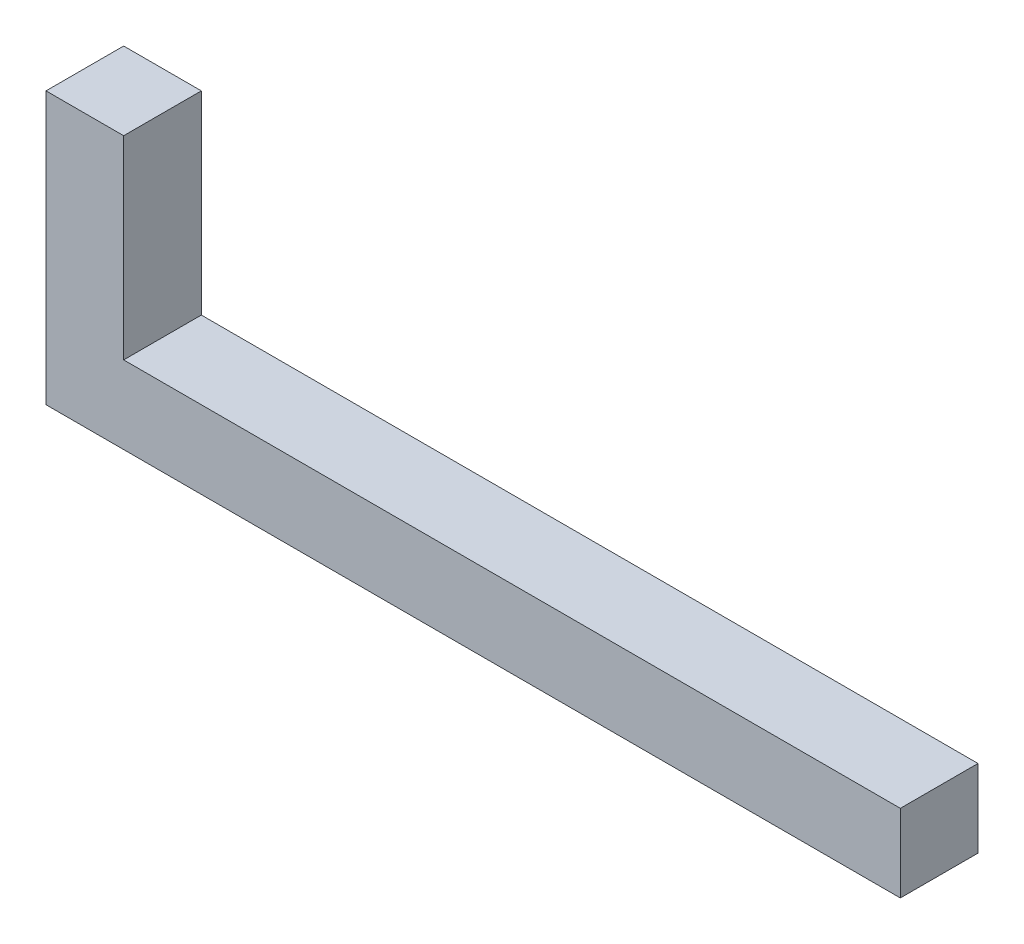
ISO-10303-21;
HEADER;
FILE_DESCRIPTION(('STEP AP214'),'2;1');
FILE_NAME('part.step','',(''),(''),'','','');
FILE_SCHEMA(('AUTOMOTIVE_DESIGN { 1 0 10303 214 1 1 1 1 }'));
ENDSEC;
DATA;
#1=APPLICATION_CONTEXT('core data for automotive mechanical design processes');
#2=APPLICATION_PROTOCOL_DEFINITION('international standard','automotive_design',2000,#1);
#3=PRODUCT_CONTEXT('',#1,'mechanical');
#4=PRODUCT('Part','Part','',(#3));
#5=PRODUCT_RELATED_PRODUCT_CATEGORY('part','',(#4));
#6=PRODUCT_DEFINITION_FORMATION('','',#4);
#7=PRODUCT_DEFINITION_CONTEXT('part definition',#1,'design');
#8=PRODUCT_DEFINITION('design','',#6,#7);
#9=PRODUCT_DEFINITION_SHAPE('','',#8);
#10=(LENGTH_UNIT() NAMED_UNIT(*) SI_UNIT(.MILLI.,.METRE.));
#11=(NAMED_UNIT(*) PLANE_ANGLE_UNIT() SI_UNIT($,.RADIAN.));
#12=(NAMED_UNIT(*) SI_UNIT($,.STERADIAN.) SOLID_ANGLE_UNIT());
#13=UNCERTAINTY_MEASURE_WITH_UNIT(LENGTH_MEASURE(1.E-05),#10,'distance_accuracy_value','');
#14=(GEOMETRIC_REPRESENTATION_CONTEXT(3) GLOBAL_UNCERTAINTY_ASSIGNED_CONTEXT((#13)) GLOBAL_UNIT_ASSIGNED_CONTEXT((#10,
#11,#12)) REPRESENTATION_CONTEXT('',''));
#15=CARTESIAN_POINT('',(0.,0.,0.));
#16=DIRECTION('',(0.,0.,1.));
#17=DIRECTION('',(1.,0.,0.));
#18=AXIS2_PLACEMENT_3D('',#15,#16,#17);
#19=CARTESIAN_POINT('',(0.,0.,10.));
#20=DIRECTION('',(-1.,0.,0.));
#21=DIRECTION('',(0.,-1.,0.));
#22=AXIS2_PLACEMENT_3D('',#19,#20,#21);
#23=PLANE('',#22);
#24=DIRECTION('',(0.,1.,0.));
#25=VECTOR('',#24,1.);
#26=CARTESIAN_POINT('',(0.,0.,0.));
#27=LINE('',#26,#25);
#28=CARTESIAN_POINT('',(0.,-10.,0.));
#29=VERTEX_POINT('',#28);
#30=CARTESIAN_POINT('',(0.,0.,0.));
#31=VERTEX_POINT('',#30);
#32=EDGE_CURVE('E128',#29,#31,#27,.T.);
#33=ORIENTED_EDGE('',*,*,#32,.T.);
#34=DIRECTION('',(0.,0.,-1.));
#35=VECTOR('',#34,1.);
#36=CARTESIAN_POINT('',(0.,0.,10.));
#37=LINE('',#36,#35);
#38=CARTESIAN_POINT('',(0.,0.,10.));
#39=VERTEX_POINT('',#38);
#40=EDGE_CURVE('E11',#39,#31,#37,.T.);
#41=ORIENTED_EDGE('',*,*,#40,.F.);
#42=DIRECTION('',(0.,1.,0.));
#43=VECTOR('',#42,1.);
#44=CARTESIAN_POINT('',(0.,0.,10.));
#45=LINE('',#44,#43);
#46=CARTESIAN_POINT('',(0.,-10.,10.));
#47=VERTEX_POINT('',#46);
#48=EDGE_CURVE('E144',#47,#39,#45,.T.);
#49=ORIENTED_EDGE('',*,*,#48,.F.);
#50=DIRECTION('',(0.,0.,-1.));
#51=VECTOR('',#50,1.);
#52=CARTESIAN_POINT('',(0.,-10.,10.));
#53=LINE('',#52,#51);
#54=EDGE_CURVE('E124',#47,#29,#53,.T.);
#55=ORIENTED_EDGE('',*,*,#54,.T.);
#56=EDGE_LOOP('',(#33,#41,#49,#55));
#57=FACE_BOUND('',#56,.T.);
#58=ADVANCED_FACE('F39',(#57),#23,.F.);
#59=CARTESIAN_POINT('',(0.,0.,10.));
#60=DIRECTION('',(0.,-1.,0.));
#61=DIRECTION('',(1.,0.,0.));
#62=AXIS2_PLACEMENT_3D('',#59,#60,#61);
#63=PLANE('',#62);
#64=DIRECTION('',(-1.,0.,0.));
#65=VECTOR('',#64,1.);
#66=CARTESIAN_POINT('',(0.,0.,0.));
#67=LINE('',#66,#65);
#68=CARTESIAN_POINT('',(-100.,0.,0.));
#69=VERTEX_POINT('',#68);
#70=EDGE_CURVE('E132',#31,#69,#67,.T.);
#71=ORIENTED_EDGE('',*,*,#70,.T.);
#72=DIRECTION('',(0.,0.,-1.));
#73=VECTOR('',#72,1.);
#74=CARTESIAN_POINT('',(-100.,0.,10.));
#75=LINE('',#74,#73);
#76=CARTESIAN_POINT('',(-100.,0.,10.));
#77=VERTEX_POINT('',#76);
#78=EDGE_CURVE('E48',#77,#69,#75,.T.);
#79=ORIENTED_EDGE('',*,*,#78,.F.);
#80=DIRECTION('',(-1.,0.,0.));
#81=VECTOR('',#80,1.);
#82=CARTESIAN_POINT('',(0.,0.,10.));
#83=LINE('',#82,#81);
#84=EDGE_CURVE('E93',#39,#77,#83,.T.);
#85=ORIENTED_EDGE('',*,*,#84,.F.);
#86=ORIENTED_EDGE('',*,*,#40,.T.);
#87=EDGE_LOOP('',(#71,#79,#85,#86));
#88=FACE_BOUND('',#87,.T.);
#89=ADVANCED_FACE('F172',(#88),#63,.F.);
#90=CARTESIAN_POINT('',(-100.,0.,10.));
#91=DIRECTION('',(-1.,0.,0.));
#92=DIRECTION('',(0.,0.,1.));
#93=AXIS2_PLACEMENT_3D('',#90,#91,#92);
#94=PLANE('',#93);
#95=DIRECTION('',(0.,1.,0.));
#96=VECTOR('',#95,1.);
#97=CARTESIAN_POINT('',(-100.,0.,0.));
#98=LINE('',#97,#96);
#99=CARTESIAN_POINT('',(-100.,25.,0.));
#100=VERTEX_POINT('',#99);
#101=EDGE_CURVE('E135',#69,#100,#98,.T.);
#102=ORIENTED_EDGE('',*,*,#101,.T.);
#103=DIRECTION('',(0.,0.,-1.));
#104=VECTOR('',#103,1.);
#105=CARTESIAN_POINT('',(-100.,25.,10.));
#106=LINE('',#105,#104);
#107=CARTESIAN_POINT('',(-100.,25.,10.));
#108=VERTEX_POINT('',#107);
#109=EDGE_CURVE('E117',#108,#100,#106,.T.);
#110=ORIENTED_EDGE('',*,*,#109,.F.);
#111=DIRECTION('',(0.,1.,0.));
#112=VECTOR('',#111,1.);
#113=CARTESIAN_POINT('',(-100.,0.,10.));
#114=LINE('',#113,#112);
#115=EDGE_CURVE('E106',#77,#108,#114,.T.);
#116=ORIENTED_EDGE('',*,*,#115,.F.);
#117=ORIENTED_EDGE('',*,*,#78,.T.);
#118=EDGE_LOOP('',(#102,#110,#116,#117));
#119=FACE_BOUND('',#118,.T.);
#120=ADVANCED_FACE('F154',(#119),#94,.F.);
#121=CARTESIAN_POINT('',(-110.,25.,10.));
#122=DIRECTION('',(0.,-1.,0.));
#123=DIRECTION('',(0.,0.,-1.));
#124=AXIS2_PLACEMENT_3D('',#121,#122,#123);
#125=PLANE('',#124);
#126=DIRECTION('',(-1.,0.,0.));
#127=VECTOR('',#126,1.);
#128=CARTESIAN_POINT('',(-110.,25.,0.));
#129=LINE('',#128,#127);
#130=CARTESIAN_POINT('',(-110.,25.,0.));
#131=VERTEX_POINT('',#130);
#132=EDGE_CURVE('E115',#100,#131,#129,.T.);
#133=ORIENTED_EDGE('',*,*,#132,.T.);
#134=DIRECTION('',(0.,0.,-1.));
#135=VECTOR('',#134,1.);
#136=CARTESIAN_POINT('',(-110.,25.,10.));
#137=LINE('',#136,#135);
#138=CARTESIAN_POINT('',(-110.,25.,10.));
#139=VERTEX_POINT('',#138);
#140=EDGE_CURVE('E112',#139,#131,#137,.T.);
#141=ORIENTED_EDGE('',*,*,#140,.F.);
#142=DIRECTION('',(-1.,0.,0.));
#143=VECTOR('',#142,1.);
#144=CARTESIAN_POINT('',(-110.,25.,10.));
#145=LINE('',#144,#143);
#146=EDGE_CURVE('E100',#108,#139,#145,.T.);
#147=ORIENTED_EDGE('',*,*,#146,.F.);
#148=ORIENTED_EDGE('',*,*,#109,.T.);
#149=EDGE_LOOP('',(#133,#141,#147,#148));
#150=FACE_BOUND('',#149,.T.);
#151=ADVANCED_FACE('F113',(#150),#125,.F.);
#152=CARTESIAN_POINT('',(-110.,-10.,10.));
#153=DIRECTION('',(1.,0.,0.));
#154=DIRECTION('',(0.,0.,-1.));
#155=AXIS2_PLACEMENT_3D('',#152,#153,#154);
#156=PLANE('',#155);
#157=DIRECTION('',(0.,-1.,0.));
#158=VECTOR('',#157,1.);
#159=CARTESIAN_POINT('',(-110.,-10.,0.));
#160=LINE('',#159,#158);
#161=CARTESIAN_POINT('',(-110.,-10.,0.));
#162=VERTEX_POINT('',#161);
#163=EDGE_CURVE('E79',#131,#162,#160,.T.);
#164=ORIENTED_EDGE('',*,*,#163,.T.);
#165=DIRECTION('',(0.,0.,-1.));
#166=VECTOR('',#165,1.);
#167=CARTESIAN_POINT('',(-110.,-10.,10.));
#168=LINE('',#167,#166);
#169=CARTESIAN_POINT('',(-110.,-10.,10.));
#170=VERTEX_POINT('',#169);
#171=EDGE_CURVE('E118',#170,#162,#168,.T.);
#172=ORIENTED_EDGE('',*,*,#171,.F.);
#173=DIRECTION('',(0.,-1.,0.));
#174=VECTOR('',#173,1.);
#175=CARTESIAN_POINT('',(-110.,-10.,10.));
#176=LINE('',#175,#174);
#177=EDGE_CURVE('E104',#139,#170,#176,.T.);
#178=ORIENTED_EDGE('',*,*,#177,.F.);
#179=ORIENTED_EDGE('',*,*,#140,.T.);
#180=EDGE_LOOP('',(#164,#172,#178,#179));
#181=FACE_BOUND('',#180,.T.);
#182=ADVANCED_FACE('F120',(#181),#156,.F.);
#183=CARTESIAN_POINT('',(0.,-10.,10.));
#184=DIRECTION('',(0.,1.,0.));
#185=DIRECTION('',(-1.,0.,0.));
#186=AXIS2_PLACEMENT_3D('',#183,#184,#185);
#187=PLANE('',#186);
#188=DIRECTION('',(1.,0.,0.));
#189=VECTOR('',#188,1.);
#190=CARTESIAN_POINT('',(0.,-10.,0.));
#191=LINE('',#190,#189);
#192=EDGE_CURVE('E85',#162,#29,#191,.T.);
#193=ORIENTED_EDGE('',*,*,#192,.T.);
#194=ORIENTED_EDGE('',*,*,#54,.F.);
#195=DIRECTION('',(1.,0.,0.));
#196=VECTOR('',#195,1.);
#197=CARTESIAN_POINT('',(0.,-10.,10.));
#198=LINE('',#197,#196);
#199=EDGE_CURVE('E56',#170,#47,#198,.T.);
#200=ORIENTED_EDGE('',*,*,#199,.F.);
#201=ORIENTED_EDGE('',*,*,#171,.T.);
#202=EDGE_LOOP('',(#193,#194,#200,#201));
#203=FACE_BOUND('',#202,.T.);
#204=ADVANCED_FACE('F161',(#203),#187,.F.);
#205=CARTESIAN_POINT('',(0.,0.,10.));
#206=DIRECTION('',(0.,0.,-1.));
#207=DIRECTION('',(-1.,0.,0.));
#208=AXIS2_PLACEMENT_3D('',#205,#206,#207);
#209=PLANE('',#208);
#210=ORIENTED_EDGE('',*,*,#48,.T.);
#211=ORIENTED_EDGE('',*,*,#84,.T.);
#212=ORIENTED_EDGE('',*,*,#115,.T.);
#213=ORIENTED_EDGE('',*,*,#146,.T.);
#214=ORIENTED_EDGE('',*,*,#177,.T.);
#215=ORIENTED_EDGE('',*,*,#199,.T.);
#216=EDGE_LOOP('',(#210,#211,#212,#213,#214,#215));
#217=FACE_BOUND('',#216,.T.);
#218=ADVANCED_FACE('F102',(#217),#209,.F.);
#219=CARTESIAN_POINT('',(0.,0.,0.));
#220=DIRECTION('',(0.,0.,-1.));
#221=DIRECTION('',(-1.,0.,0.));
#222=AXIS2_PLACEMENT_3D('',#219,#220,#221);
#223=PLANE('',#222);
#224=ORIENTED_EDGE('',*,*,#32,.F.);
#225=ORIENTED_EDGE('',*,*,#192,.F.);
#226=ORIENTED_EDGE('',*,*,#163,.F.);
#227=ORIENTED_EDGE('',*,*,#132,.F.);
#228=ORIENTED_EDGE('',*,*,#101,.F.);
#229=ORIENTED_EDGE('',*,*,#70,.F.);
#230=EDGE_LOOP('',(#224,#225,#226,#227,#228,#229));
#231=FACE_BOUND('',#230,.T.);
#232=ADVANCED_FACE('F157',(#231),#223,.T.);
#233=CLOSED_SHELL('',(#58,#89,#120,#151,#182,#204,#218,#232));
#234=MANIFOLD_SOLID_BREP('B2',#233);
#235=ADVANCED_BREP_SHAPE_REPRESENTATION('',(#18,#234),#14);
#236=SHAPE_DEFINITION_REPRESENTATION(#9,#235);
ENDSEC;
END-ISO-10303-21;
